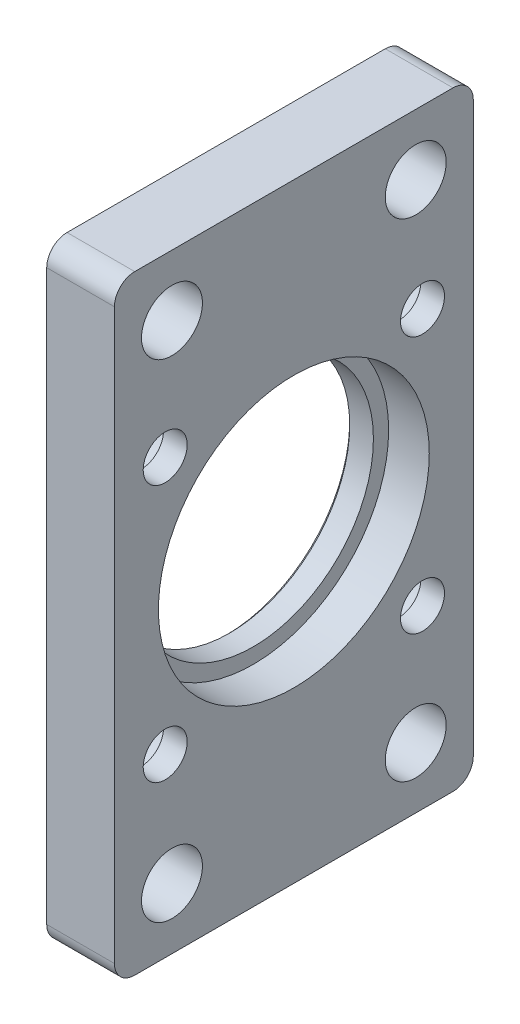
ISO-10303-21;
HEADER;
FILE_DESCRIPTION(('STEP AP214'),'2;1');
FILE_NAME('part.step','',(''),(''),'','','');
FILE_SCHEMA(('AUTOMOTIVE_DESIGN { 1 0 10303 214 1 1 1 1 }'));
ENDSEC;
DATA;
#1=APPLICATION_CONTEXT('core data for automotive mechanical design processes');
#2=APPLICATION_PROTOCOL_DEFINITION('international standard','automotive_design',2000,#1);
#3=PRODUCT_CONTEXT('',#1,'mechanical');
#4=PRODUCT('Part','Part','',(#3));
#5=PRODUCT_RELATED_PRODUCT_CATEGORY('part','',(#4));
#6=PRODUCT_DEFINITION_FORMATION('','',#4);
#7=PRODUCT_DEFINITION_CONTEXT('part definition',#1,'design');
#8=PRODUCT_DEFINITION('design','',#6,#7);
#9=PRODUCT_DEFINITION_SHAPE('','',#8);
#10=(LENGTH_UNIT() NAMED_UNIT(*) SI_UNIT(.MILLI.,.METRE.));
#11=(NAMED_UNIT(*) PLANE_ANGLE_UNIT() SI_UNIT($,.RADIAN.));
#12=(NAMED_UNIT(*) SI_UNIT($,.STERADIAN.) SOLID_ANGLE_UNIT());
#13=UNCERTAINTY_MEASURE_WITH_UNIT(LENGTH_MEASURE(1.E-05),#10,'distance_accuracy_value','');
#14=(GEOMETRIC_REPRESENTATION_CONTEXT(3) GLOBAL_UNCERTAINTY_ASSIGNED_CONTEXT((#13)) GLOBAL_UNIT_ASSIGNED_CONTEXT((#10,
#11,#12)) REPRESENTATION_CONTEXT('',''));
#15=CARTESIAN_POINT('',(0.,0.,0.));
#16=DIRECTION('',(0.,0.,1.));
#17=DIRECTION('',(1.,0.,0.));
#18=AXIS2_PLACEMENT_3D('',#15,#16,#17);
#19=CARTESIAN_POINT('',(-10.,0.,0.));
#20=DIRECTION('',(1.,0.,0.));
#21=DIRECTION('',(0.,0.,-1.));
#22=AXIS2_PLACEMENT_3D('',#19,#20,#21);
#23=CYLINDRICAL_SURFACE('',#22,17.75);
#24=CARTESIAN_POINT('',(-9.5,0.,0.));
#25=DIRECTION('',(1.,0.,0.));
#26=DIRECTION('',(0.,0.,-1.));
#27=AXIS2_PLACEMENT_3D('',#24,#25,#26);
#28=CIRCLE('',#27,17.75);
#29=CARTESIAN_POINT('',(-9.5,0.,-17.75));
#30=VERTEX_POINT('',#29);
#31=EDGE_CURVE('E211',#30,#30,#28,.T.);
#32=ORIENTED_EDGE('',*,*,#31,.F.);
#33=EDGE_LOOP('',(#32));
#34=FACE_BOUND('',#33,.T.);
#35=CARTESIAN_POINT('',(-6.,0.,0.));
#36=DIRECTION('',(1.,0.,0.));
#37=DIRECTION('',(0.,0.,-1.));
#38=AXIS2_PLACEMENT_3D('',#35,#36,#37);
#39=CIRCLE('',#38,17.75);
#40=CARTESIAN_POINT('',(-6.,0.,-17.75));
#41=VERTEX_POINT('',#40);
#42=EDGE_CURVE('E38',#41,#41,#39,.F.);
#43=ORIENTED_EDGE('',*,*,#42,.F.);
#44=EDGE_LOOP('',(#43));
#45=FACE_BOUND('',#44,.T.);
#46=ADVANCED_FACE('F34',(#34,#45),#23,.F.);
#47=CARTESIAN_POINT('',(0.,19.,-19.));
#48=DIRECTION('',(-1.,0.,0.));
#49=DIRECTION('',(0.,0.,1.));
#50=AXIS2_PLACEMENT_3D('',#47,#48,#49);
#51=CYLINDRICAL_SURFACE('',#50,5.5);
#52=CARTESIAN_POINT('',(-9.49999999994589,19.,-19.));
#53=DIRECTION('',(-1.,0.,0.));
#54=DIRECTION('',(0.,0.,1.));
#55=AXIS2_PLACEMENT_3D('',#52,#53,#54);
#56=CIRCLE('',#55,5.50000000003501);
#57=CARTESIAN_POINT('',(-9.49999999994589,19.,-13.499999999965));
#58=VERTEX_POINT('',#57);
#59=EDGE_CURVE('E166',#58,#58,#56,.T.);
#60=ORIENTED_EDGE('',*,*,#59,.T.);
#61=EDGE_LOOP('',(#60));
#62=FACE_BOUND('',#61,.T.);
#63=CARTESIAN_POINT('',(-3.5,19.,-19.));
#64=DIRECTION('',(-1.,0.,0.));
#65=DIRECTION('',(0.,0.,1.));
#66=AXIS2_PLACEMENT_3D('',#63,#64,#65);
#67=CIRCLE('',#66,5.5);
#68=CARTESIAN_POINT('',(-3.5,19.,-13.5));
#69=VERTEX_POINT('',#68);
#70=EDGE_CURVE('E155',#69,#69,#67,.T.);
#71=ORIENTED_EDGE('',*,*,#70,.F.);
#72=EDGE_LOOP('',(#71));
#73=FACE_BOUND('',#72,.T.);
#74=ADVANCED_FACE('F36',(#62,#73),#51,.F.);
#75=CARTESIAN_POINT('',(0.,-19.,-19.));
#76=DIRECTION('',(-1.,0.,0.));
#77=DIRECTION('',(0.,0.,1.));
#78=AXIS2_PLACEMENT_3D('',#75,#76,#77);
#79=CYLINDRICAL_SURFACE('',#78,5.5);
#80=CARTESIAN_POINT('',(-9.49999999994589,-19.,-19.));
#81=DIRECTION('',(-1.,0.,0.));
#82=DIRECTION('',(0.,0.,1.));
#83=AXIS2_PLACEMENT_3D('',#80,#81,#82);
#84=CIRCLE('',#83,5.50000000003501);
#85=CARTESIAN_POINT('',(-9.49999999994589,-19.,-13.499999999965));
#86=VERTEX_POINT('',#85);
#87=EDGE_CURVE('E161',#86,#86,#84,.T.);
#88=ORIENTED_EDGE('',*,*,#87,.T.);
#89=EDGE_LOOP('',(#88));
#90=FACE_BOUND('',#89,.T.);
#91=CARTESIAN_POINT('',(-3.5,-19.,-19.));
#92=DIRECTION('',(-1.,0.,0.));
#93=DIRECTION('',(0.,0.,1.));
#94=AXIS2_PLACEMENT_3D('',#91,#92,#93);
#95=CIRCLE('',#94,5.5);
#96=CARTESIAN_POINT('',(-3.5,-19.,-13.5));
#97=VERTEX_POINT('',#96);
#98=EDGE_CURVE('E258',#97,#97,#95,.T.);
#99=ORIENTED_EDGE('',*,*,#98,.F.);
#100=EDGE_LOOP('',(#99));
#101=FACE_BOUND('',#100,.T.);
#102=ADVANCED_FACE('F267',(#90,#101),#79,.F.);
#103=CARTESIAN_POINT('',(-10.0000000000477,19.,-19.));
#104=DIRECTION('',(-1.,0.,0.));
#105=DIRECTION('',(0.,0.,1.));
#106=AXIS2_PLACEMENT_3D('',#103,#104,#105);
#107=CONICAL_SURFACE('',#106,6.00000000008003,0.785398163340605);
#108=CARTESIAN_POINT('',(-9.99999999999091,19.,-19.));
#109=DIRECTION('',(-1.,0.,0.));
#110=DIRECTION('',(0.,0.,1.));
#111=AXIS2_PLACEMENT_3D('',#108,#109,#110);
#112=CIRCLE('',#111,6.00000000002319);
#113=CARTESIAN_POINT('',(-9.99999999999091,19.,-12.9999999999768));
#114=VERTEX_POINT('',#113);
#115=EDGE_CURVE('E249',#114,#114,#112,.T.);
#116=ORIENTED_EDGE('',*,*,#115,.T.);
#117=EDGE_LOOP('',(#116));
#118=FACE_BOUND('',#117,.T.);
#119=ORIENTED_EDGE('',*,*,#59,.F.);
#120=EDGE_LOOP('',(#119));
#121=FACE_BOUND('',#120,.T.);
#122=ADVANCED_FACE('F274',(#118,#121),#107,.F.);
#123=CARTESIAN_POINT('',(-10.0000000000477,-19.,-19.));
#124=DIRECTION('',(-1.,0.,0.));
#125=DIRECTION('',(0.,0.,1.));
#126=AXIS2_PLACEMENT_3D('',#123,#124,#125);
#127=CONICAL_SURFACE('',#126,6.00000000008003,0.785398163340605);
#128=CARTESIAN_POINT('',(-9.99999999999091,-19.,-19.));
#129=DIRECTION('',(-1.,0.,0.));
#130=DIRECTION('',(0.,0.,1.));
#131=AXIS2_PLACEMENT_3D('',#128,#129,#130);
#132=CIRCLE('',#131,6.00000000002319);
#133=CARTESIAN_POINT('',(-9.99999999999091,-19.,-12.9999999999768));
#134=VERTEX_POINT('',#133);
#135=EDGE_CURVE('E246',#134,#134,#132,.T.);
#136=ORIENTED_EDGE('',*,*,#135,.T.);
#137=EDGE_LOOP('',(#136));
#138=FACE_BOUND('',#137,.T.);
#139=ORIENTED_EDGE('',*,*,#87,.F.);
#140=EDGE_LOOP('',(#139));
#141=FACE_BOUND('',#140,.T.);
#142=ADVANCED_FACE('F404',(#138,#141),#127,.F.);
#143=CARTESIAN_POINT('',(-9.99999999987722,-19.,19.));
#144=DIRECTION('',(-1.,0.,0.));
#145=DIRECTION('',(0.,0.,1.));
#146=AXIS2_PLACEMENT_3D('',#143,#144,#145);
#147=CONICAL_SURFACE('',#146,5.99999999986358,0.785398163454292);
#148=CARTESIAN_POINT('',(-9.99999999999091,-19.,19.));
#149=DIRECTION('',(-1.,0.,0.));
#150=DIRECTION('',(0.,0.,1.));
#151=AXIS2_PLACEMENT_3D('',#148,#149,#150);
#152=CIRCLE('',#151,5.99999999997726);
#153=CARTESIAN_POINT('',(-9.99999999999091,-19.,24.9999999999773));
#154=VERTEX_POINT('',#153);
#155=EDGE_CURVE('E243',#154,#154,#152,.T.);
#156=ORIENTED_EDGE('',*,*,#155,.T.);
#157=EDGE_LOOP('',(#156));
#158=FACE_BOUND('',#157,.T.);
#159=CARTESIAN_POINT('',(-9.5,-19.,19.));
#160=DIRECTION('',(-1.,0.,0.));
#161=DIRECTION('',(0.,0.,1.));
#162=AXIS2_PLACEMENT_3D('',#159,#160,#161);
#163=CIRCLE('',#162,5.5);
#164=CARTESIAN_POINT('',(-9.5,-19.,24.5));
#165=VERTEX_POINT('',#164);
#166=EDGE_CURVE('E156',#165,#165,#163,.F.);
#167=ORIENTED_EDGE('',*,*,#166,.T.);
#168=EDGE_LOOP('',(#167));
#169=FACE_BOUND('',#168,.T.);
#170=ADVANCED_FACE('F400',(#158,#169),#147,.F.);
#171=CARTESIAN_POINT('',(-9.99999999987722,19.,19.));
#172=DIRECTION('',(-1.,0.,0.));
#173=DIRECTION('',(0.,0.,1.));
#174=AXIS2_PLACEMENT_3D('',#171,#172,#173);
#175=CONICAL_SURFACE('',#174,5.99999999986358,0.785398163454292);
#176=CARTESIAN_POINT('',(-9.99999999999091,19.,19.));
#177=DIRECTION('',(-1.,0.,0.));
#178=DIRECTION('',(0.,0.,1.));
#179=AXIS2_PLACEMENT_3D('',#176,#177,#178);
#180=CIRCLE('',#179,5.99999999997726);
#181=CARTESIAN_POINT('',(-9.99999999999091,19.,24.9999999999773));
#182=VERTEX_POINT('',#181);
#183=EDGE_CURVE('E240',#182,#182,#180,.T.);
#184=ORIENTED_EDGE('',*,*,#183,.T.);
#185=EDGE_LOOP('',(#184));
#186=FACE_BOUND('',#185,.T.);
#187=CARTESIAN_POINT('',(-9.5,19.,19.));
#188=DIRECTION('',(-1.,0.,0.));
#189=DIRECTION('',(0.,0.,1.));
#190=AXIS2_PLACEMENT_3D('',#187,#188,#189);
#191=CIRCLE('',#190,5.5);
#192=CARTESIAN_POINT('',(-9.5,19.,24.5));
#193=VERTEX_POINT('',#192);
#194=EDGE_CURVE('E152',#193,#193,#191,.F.);
#195=ORIENTED_EDGE('',*,*,#194,.T.);
#196=EDGE_LOOP('',(#195));
#197=FACE_BOUND('',#196,.T.);
#198=ADVANCED_FACE('F396',(#186,#197),#175,.F.);
#199=CARTESIAN_POINT('',(0.,-19.,19.));
#200=DIRECTION('',(-1.,0.,0.));
#201=DIRECTION('',(0.,0.,1.));
#202=AXIS2_PLACEMENT_3D('',#199,#200,#201);
#203=CYLINDRICAL_SURFACE('',#202,5.5);
#204=ORIENTED_EDGE('',*,*,#166,.F.);
#205=EDGE_LOOP('',(#204));
#206=FACE_BOUND('',#205,.T.);
#207=CARTESIAN_POINT('',(-3.5,-19.,19.));
#208=DIRECTION('',(-1.,0.,0.));
#209=DIRECTION('',(0.,0.,1.));
#210=AXIS2_PLACEMENT_3D('',#207,#208,#209);
#211=CIRCLE('',#210,5.5);
#212=CARTESIAN_POINT('',(-3.5,-19.,24.5));
#213=VERTEX_POINT('',#212);
#214=EDGE_CURVE('E237',#213,#213,#211,.T.);
#215=ORIENTED_EDGE('',*,*,#214,.F.);
#216=EDGE_LOOP('',(#215));
#217=FACE_BOUND('',#216,.T.);
#218=ADVANCED_FACE('F392',(#206,#217),#203,.F.);
#219=CARTESIAN_POINT('',(0.,19.,19.));
#220=DIRECTION('',(-1.,0.,0.));
#221=DIRECTION('',(0.,0.,1.));
#222=AXIS2_PLACEMENT_3D('',#219,#220,#221);
#223=CYLINDRICAL_SURFACE('',#222,5.5);
#224=ORIENTED_EDGE('',*,*,#194,.F.);
#225=EDGE_LOOP('',(#224));
#226=FACE_BOUND('',#225,.T.);
#227=CARTESIAN_POINT('',(-3.5,19.,19.));
#228=DIRECTION('',(-1.,0.,0.));
#229=DIRECTION('',(0.,0.,1.));
#230=AXIS2_PLACEMENT_3D('',#227,#228,#229);
#231=CIRCLE('',#230,5.5);
#232=CARTESIAN_POINT('',(-3.5,19.,24.5));
#233=VERTEX_POINT('',#232);
#234=EDGE_CURVE('E234',#233,#233,#231,.T.);
#235=ORIENTED_EDGE('',*,*,#234,.F.);
#236=EDGE_LOOP('',(#235));
#237=FACE_BOUND('',#236,.T.);
#238=ADVANCED_FACE('F388',(#226,#237),#223,.F.);
#239=CARTESIAN_POINT('',(-9.99999999993406,36.,18.));
#240=DIRECTION('',(-1.,0.,0.));
#241=DIRECTION('',(0.,0.,1.));
#242=AXIS2_PLACEMENT_3D('',#239,#240,#241);
#243=CONICAL_SURFACE('',#242,4.99999999996771,0.785398163397448);
#244=CARTESIAN_POINT('',(-9.99999999999091,36.,18.));
#245=DIRECTION('',(-1.,0.,0.));
#246=DIRECTION('',(0.,0.,1.));
#247=AXIS2_PLACEMENT_3D('',#244,#245,#246);
#248=CIRCLE('',#247,5.00000000002455);
#249=CARTESIAN_POINT('',(-9.99999999999091,36.,23.0000000000246));
#250=VERTEX_POINT('',#249);
#251=EDGE_CURVE('E255',#250,#250,#248,.T.);
#252=ORIENTED_EDGE('',*,*,#251,.T.);
#253=EDGE_LOOP('',(#252));
#254=FACE_BOUND('',#253,.T.);
#255=CARTESIAN_POINT('',(-9.5,36.,18.));
#256=DIRECTION('',(-1.,0.,0.));
#257=DIRECTION('',(0.,0.,1.));
#258=AXIS2_PLACEMENT_3D('',#255,#256,#257);
#259=CIRCLE('',#258,4.5);
#260=CARTESIAN_POINT('',(-9.5,36.,22.5));
#261=VERTEX_POINT('',#260);
#262=EDGE_CURVE('E135',#261,#261,#259,.F.);
#263=ORIENTED_EDGE('',*,*,#262,.T.);
#264=EDGE_LOOP('',(#263));
#265=FACE_BOUND('',#264,.T.);
#266=ADVANCED_FACE('F384',(#254,#265),#243,.F.);
#267=CARTESIAN_POINT('',(-9.99999999993406,-36.,18.));
#268=DIRECTION('',(-1.,0.,0.));
#269=DIRECTION('',(0.,0.,1.));
#270=AXIS2_PLACEMENT_3D('',#267,#268,#269);
#271=CONICAL_SURFACE('',#270,4.99999999996771,0.785398163397448);
#272=CARTESIAN_POINT('',(-9.99999999999091,-36.,18.));
#273=DIRECTION('',(-1.,0.,0.));
#274=DIRECTION('',(0.,0.,1.));
#275=AXIS2_PLACEMENT_3D('',#272,#273,#274);
#276=CIRCLE('',#275,5.00000000002455);
#277=CARTESIAN_POINT('',(-9.99999999999091,-36.,23.0000000000246));
#278=VERTEX_POINT('',#277);
#279=EDGE_CURVE('E252',#278,#278,#276,.T.);
#280=ORIENTED_EDGE('',*,*,#279,.T.);
#281=EDGE_LOOP('',(#280));
#282=FACE_BOUND('',#281,.T.);
#283=CARTESIAN_POINT('',(-9.5,-36.,18.));
#284=DIRECTION('',(-1.,0.,0.));
#285=DIRECTION('',(0.,0.,1.));
#286=AXIS2_PLACEMENT_3D('',#283,#284,#285);
#287=CIRCLE('',#286,4.5);
#288=CARTESIAN_POINT('',(-9.5,-36.,22.5));
#289=VERTEX_POINT('',#288);
#290=EDGE_CURVE('E131',#289,#289,#287,.F.);
#291=ORIENTED_EDGE('',*,*,#290,.T.);
#292=EDGE_LOOP('',(#291));
#293=FACE_BOUND('',#292,.T.);
#294=ADVANCED_FACE('F381',(#282,#293),#271,.F.);
#295=CARTESIAN_POINT('',(-3.5,19.,-24.5));
#296=DIRECTION('',(-1.,0.,0.));
#297=DIRECTION('',(0.,0.,1.));
#298=AXIS2_PLACEMENT_3D('',#295,#296,#297);
#299=PLANE('',#298);
#300=ORIENTED_EDGE('',*,*,#70,.T.);
#301=EDGE_LOOP('',(#300));
#302=FACE_BOUND('',#301,.T.);
#303=CARTESIAN_POINT('',(-3.5,19.,-19.));
#304=DIRECTION('',(-1.,0.,0.));
#305=DIRECTION('',(0.,0.,1.));
#306=AXIS2_PLACEMENT_3D('',#303,#304,#305);
#307=CIRCLE('',#306,3.25);
#308=CARTESIAN_POINT('',(-3.5,19.,-15.75));
#309=VERTEX_POINT('',#308);
#310=EDGE_CURVE('E134',#309,#309,#307,.F.);
#311=ORIENTED_EDGE('',*,*,#310,.T.);
#312=EDGE_LOOP('',(#311));
#313=FACE_BOUND('',#312,.T.);
#314=ADVANCED_FACE('F263',(#302,#313),#299,.T.);
#315=CARTESIAN_POINT('',(-3.5,-19.,-24.5));
#316=DIRECTION('',(-1.,0.,0.));
#317=DIRECTION('',(0.,0.,1.));
#318=AXIS2_PLACEMENT_3D('',#315,#316,#317);
#319=PLANE('',#318);
#320=ORIENTED_EDGE('',*,*,#98,.T.);
#321=EDGE_LOOP('',(#320));
#322=FACE_BOUND('',#321,.T.);
#323=CARTESIAN_POINT('',(-3.5,-19.,-19.));
#324=DIRECTION('',(-1.,0.,0.));
#325=DIRECTION('',(0.,0.,1.));
#326=AXIS2_PLACEMENT_3D('',#323,#324,#325);
#327=CIRCLE('',#326,3.25);
#328=CARTESIAN_POINT('',(-3.5,-19.,-15.75));
#329=VERTEX_POINT('',#328);
#330=EDGE_CURVE('E144',#329,#329,#327,.F.);
#331=ORIENTED_EDGE('',*,*,#330,.T.);
#332=EDGE_LOOP('',(#331));
#333=FACE_BOUND('',#332,.T.);
#334=ADVANCED_FACE('F374',(#322,#333),#319,.T.);
#335=CARTESIAN_POINT('',(-10.,-42.,23.5));
#336=DIRECTION('',(1.,0.,0.));
#337=DIRECTION('',(0.,0.,-1.));
#338=AXIS2_PLACEMENT_3D('',#335,#336,#337);
#339=PLANE('',#338);
#340=CARTESIAN_POINT('',(-9.99999999999091,36.,-18.));
#341=DIRECTION('',(-1.,0.,0.));
#342=DIRECTION('',(0.,0.,1.));
#343=AXIS2_PLACEMENT_3D('',#340,#341,#342);
#344=CIRCLE('',#343,5.00000000008004);
#345=CARTESIAN_POINT('',(-9.99999999999091,36.,-12.99999999992));
#346=VERTEX_POINT('',#345);
#347=EDGE_CURVE('E140',#346,#346,#344,.F.);
#348=ORIENTED_EDGE('',*,*,#347,.T.);
#349=EDGE_LOOP('',(#348));
#350=FACE_BOUND('',#349,.T.);
#351=CARTESIAN_POINT('',(-9.99999999999091,-36.,-18.));
#352=DIRECTION('',(-1.,0.,0.));
#353=DIRECTION('',(0.,0.,1.));
#354=AXIS2_PLACEMENT_3D('',#351,#352,#353);
#355=CIRCLE('',#354,5.00000000008004);
#356=CARTESIAN_POINT('',(-9.99999999999091,-36.,-12.99999999992));
#357=VERTEX_POINT('',#356);
#358=EDGE_CURVE('E228',#357,#357,#355,.F.);
#359=ORIENTED_EDGE('',*,*,#358,.T.);
#360=EDGE_LOOP('',(#359));
#361=FACE_BOUND('',#360,.T.);
#362=CARTESIAN_POINT('',(-10.,0.,0.));
#363=DIRECTION('',(-1.,0.,0.));
#364=DIRECTION('',(0.,-1.,0.));
#365=AXIS2_PLACEMENT_3D('',#362,#363,#364);
#366=CIRCLE('',#365,18.25);
#367=CARTESIAN_POINT('',(-10.,-18.25,0.));
#368=VERTEX_POINT('',#367);
#369=EDGE_CURVE('E231',#368,#368,#366,.F.);
#370=ORIENTED_EDGE('',*,*,#369,.T.);
#371=EDGE_LOOP('',(#370));
#372=FACE_BOUND('',#371,.T.);
#373=ORIENTED_EDGE('',*,*,#183,.F.);
#374=EDGE_LOOP('',(#373));
#375=FACE_BOUND('',#374,.T.);
#376=ORIENTED_EDGE('',*,*,#155,.F.);
#377=EDGE_LOOP('',(#376));
#378=FACE_BOUND('',#377,.T.);
#379=CARTESIAN_POINT('',(-10.,42.,23.5));
#380=DIRECTION('',(-1.,0.,0.));
#381=DIRECTION('',(0.,0.,1.));
#382=AXIS2_PLACEMENT_3D('',#379,#380,#381);
#383=CIRCLE('',#382,2.99999999999998);
#384=CARTESIAN_POINT('',(-10.,45.,23.5));
#385=VERTEX_POINT('',#384);
#386=CARTESIAN_POINT('',(-10.,42.,26.5));
#387=VERTEX_POINT('',#386);
#388=EDGE_CURVE('E216',#385,#387,#383,.F.);
#389=ORIENTED_EDGE('',*,*,#388,.F.);
#390=DIRECTION('',(0.,0.,1.));
#391=VECTOR('',#390,1.);
#392=CARTESIAN_POINT('',(-10.,45.,-23.5));
#393=LINE('',#392,#391);
#394=CARTESIAN_POINT('',(-10.,45.,-23.5));
#395=VERTEX_POINT('',#394);
#396=EDGE_CURVE('E145',#395,#385,#393,.T.);
#397=ORIENTED_EDGE('',*,*,#396,.F.);
#398=CARTESIAN_POINT('',(-10.,42.,-23.5));
#399=DIRECTION('',(-1.,0.,0.));
#400=DIRECTION('',(0.,0.,1.));
#401=AXIS2_PLACEMENT_3D('',#398,#399,#400);
#402=CIRCLE('',#401,2.99999999999999);
#403=CARTESIAN_POINT('',(-10.,42.,-26.5));
#404=VERTEX_POINT('',#403);
#405=EDGE_CURVE('E219',#404,#395,#402,.F.);
#406=ORIENTED_EDGE('',*,*,#405,.F.);
#407=DIRECTION('',(0.,1.,0.));
#408=VECTOR('',#407,1.);
#409=CARTESIAN_POINT('',(-10.,-42.,-26.5));
#410=LINE('',#409,#408);
#411=CARTESIAN_POINT('',(-10.,-42.,-26.5));
#412=VERTEX_POINT('',#411);
#413=EDGE_CURVE('E148',#412,#404,#410,.T.);
#414=ORIENTED_EDGE('',*,*,#413,.F.);
#415=CARTESIAN_POINT('',(-10.,-42.,-23.5));
#416=DIRECTION('',(-1.,0.,0.));
#417=DIRECTION('',(0.,0.,1.));
#418=AXIS2_PLACEMENT_3D('',#415,#416,#417);
#419=CIRCLE('',#418,2.99999999999998);
#420=CARTESIAN_POINT('',(-10.,-45.,-23.5));
#421=VERTEX_POINT('',#420);
#422=EDGE_CURVE('E117',#421,#412,#419,.F.);
#423=ORIENTED_EDGE('',*,*,#422,.F.);
#424=DIRECTION('',(0.,0.,-1.));
#425=VECTOR('',#424,1.);
#426=CARTESIAN_POINT('',(-10.,-45.,23.5));
#427=LINE('',#426,#425);
#428=CARTESIAN_POINT('',(-10.,-45.,23.5));
#429=VERTEX_POINT('',#428);
#430=EDGE_CURVE('E112',#429,#421,#427,.T.);
#431=ORIENTED_EDGE('',*,*,#430,.F.);
#432=CARTESIAN_POINT('',(-10.,-42.,23.5));
#433=DIRECTION('',(-1.,0.,0.));
#434=DIRECTION('',(0.,0.,1.));
#435=AXIS2_PLACEMENT_3D('',#432,#433,#434);
#436=CIRCLE('',#435,2.99999999999999);
#437=CARTESIAN_POINT('',(-10.,-42.,26.5));
#438=VERTEX_POINT('',#437);
#439=EDGE_CURVE('E101',#438,#429,#436,.F.);
#440=ORIENTED_EDGE('',*,*,#439,.F.);
#441=DIRECTION('',(0.,-1.,0.));
#442=VECTOR('',#441,1.);
#443=CARTESIAN_POINT('',(-10.,42.,26.5));
#444=LINE('',#443,#442);
#445=EDGE_CURVE('E96',#387,#438,#444,.T.);
#446=ORIENTED_EDGE('',*,*,#445,.F.);
#447=EDGE_LOOP('',(#389,#397,#406,#414,#423,#431,#440,#446));
#448=FACE_BOUND('',#447,.T.);
#449=ORIENTED_EDGE('',*,*,#135,.F.);
#450=EDGE_LOOP('',(#449));
#451=FACE_BOUND('',#450,.T.);
#452=ORIENTED_EDGE('',*,*,#115,.F.);
#453=EDGE_LOOP('',(#452));
#454=FACE_BOUND('',#453,.T.);
#455=ORIENTED_EDGE('',*,*,#279,.F.);
#456=EDGE_LOOP('',(#455));
#457=FACE_BOUND('',#456,.T.);
#458=ORIENTED_EDGE('',*,*,#251,.F.);
#459=EDGE_LOOP('',(#458));
#460=FACE_BOUND('',#459,.T.);
#461=ADVANCED_FACE('F114',(#350,#361,#372,#375,#378,#448,#451,#454,#457,#460),#339,.F.);
#462=CARTESIAN_POINT('',(-3.5,-19.,13.5));
#463=DIRECTION('',(-1.,0.,0.));
#464=DIRECTION('',(0.,0.,1.));
#465=AXIS2_PLACEMENT_3D('',#462,#463,#464);
#466=PLANE('',#465);
#467=ORIENTED_EDGE('',*,*,#214,.T.);
#468=EDGE_LOOP('',(#467));
#469=FACE_BOUND('',#468,.T.);
#470=CARTESIAN_POINT('',(-3.5,-19.,19.));
#471=DIRECTION('',(-1.,0.,0.));
#472=DIRECTION('',(0.,0.,1.));
#473=AXIS2_PLACEMENT_3D('',#470,#471,#472);
#474=CIRCLE('',#473,3.25);
#475=CARTESIAN_POINT('',(-3.5,-19.,22.25));
#476=VERTEX_POINT('',#475);
#477=EDGE_CURVE('E212',#476,#476,#474,.F.);
#478=ORIENTED_EDGE('',*,*,#477,.T.);
#479=EDGE_LOOP('',(#478));
#480=FACE_BOUND('',#479,.T.);
#481=ADVANCED_FACE('F367',(#469,#480),#466,.T.);
#482=CARTESIAN_POINT('',(-3.5,19.,13.5));
#483=DIRECTION('',(-1.,0.,0.));
#484=DIRECTION('',(0.,0.,1.));
#485=AXIS2_PLACEMENT_3D('',#482,#483,#484);
#486=PLANE('',#485);
#487=ORIENTED_EDGE('',*,*,#234,.T.);
#488=EDGE_LOOP('',(#487));
#489=FACE_BOUND('',#488,.T.);
#490=CARTESIAN_POINT('',(-3.5,19.,19.));
#491=DIRECTION('',(-1.,0.,0.));
#492=DIRECTION('',(0.,0.,1.));
#493=AXIS2_PLACEMENT_3D('',#490,#491,#492);
#494=CIRCLE('',#493,3.25);
#495=CARTESIAN_POINT('',(-3.5,19.,22.25));
#496=VERTEX_POINT('',#495);
#497=EDGE_CURVE('E208',#496,#496,#494,.F.);
#498=ORIENTED_EDGE('',*,*,#497,.T.);
#499=EDGE_LOOP('',(#498));
#500=FACE_BOUND('',#499,.T.);
#501=ADVANCED_FACE('F363',(#489,#500),#486,.T.);
#502=CARTESIAN_POINT('',(-10.,0.,0.));
#503=DIRECTION('',(-1.,0.,0.));
#504=DIRECTION('',(0.,-1.,0.));
#505=AXIS2_PLACEMENT_3D('',#502,#503,#504);
#506=CONICAL_SURFACE('',#505,18.25,0.785398163397445);
#507=ORIENTED_EDGE('',*,*,#31,.T.);
#508=EDGE_LOOP('',(#507));
#509=FACE_BOUND('',#508,.T.);
#510=ORIENTED_EDGE('',*,*,#369,.F.);
#511=EDGE_LOOP('',(#510));
#512=FACE_BOUND('',#511,.T.);
#513=ADVANCED_FACE('F359',(#509,#512),#506,.F.);
#514=CARTESIAN_POINT('',(-9.99999999987722,-36.,-18.));
#515=DIRECTION('',(-1.,0.,0.));
#516=DIRECTION('',(0.,0.,1.));
#517=AXIS2_PLACEMENT_3D('',#514,#515,#516);
#518=CONICAL_SURFACE('',#517,4.99999999996635,0.785398163397448);
#519=ORIENTED_EDGE('',*,*,#358,.F.);
#520=EDGE_LOOP('',(#519));
#521=FACE_BOUND('',#520,.T.);
#522=CARTESIAN_POINT('',(-9.5,-36.,-18.));
#523=DIRECTION('',(-1.,0.,0.));
#524=DIRECTION('',(0.,0.,1.));
#525=AXIS2_PLACEMENT_3D('',#522,#523,#524);
#526=CIRCLE('',#525,4.5);
#527=CARTESIAN_POINT('',(-9.5,-36.,-13.5));
#528=VERTEX_POINT('',#527);
#529=EDGE_CURVE('E692',#528,#528,#526,.F.);
#530=ORIENTED_EDGE('',*,*,#529,.T.);
#531=EDGE_LOOP('',(#530));
#532=FACE_BOUND('',#531,.T.);
#533=ADVANCED_FACE('F355',(#521,#532),#518,.F.);
#534=CARTESIAN_POINT('',(-9.99999999987722,36.,-18.));
#535=DIRECTION('',(-1.,0.,0.));
#536=DIRECTION('',(0.,0.,1.));
#537=AXIS2_PLACEMENT_3D('',#534,#535,#536);
#538=CONICAL_SURFACE('',#537,4.99999999996635,0.785398163397448);
#539=ORIENTED_EDGE('',*,*,#347,.F.);
#540=EDGE_LOOP('',(#539));
#541=FACE_BOUND('',#540,.T.);
#542=CARTESIAN_POINT('',(-9.5,36.,-18.));
#543=DIRECTION('',(-1.,0.,0.));
#544=DIRECTION('',(0.,0.,1.));
#545=AXIS2_PLACEMENT_3D('',#542,#543,#544);
#546=CIRCLE('',#545,4.5);
#547=CARTESIAN_POINT('',(-9.5,36.,-13.5));
#548=VERTEX_POINT('',#547);
#549=EDGE_CURVE('E207',#548,#548,#546,.F.);
#550=ORIENTED_EDGE('',*,*,#549,.T.);
#551=EDGE_LOOP('',(#550));
#552=FACE_BOUND('',#551,.T.);
#553=ADVANCED_FACE('F351',(#541,#552),#538,.F.);
#554=CARTESIAN_POINT('',(0.,36.,18.));
#555=DIRECTION('',(-1.,0.,0.));
#556=DIRECTION('',(0.,0.,1.));
#557=AXIS2_PLACEMENT_3D('',#554,#555,#556);
#558=CYLINDRICAL_SURFACE('',#557,4.5);
#559=ORIENTED_EDGE('',*,*,#262,.F.);
#560=EDGE_LOOP('',(#559));
#561=FACE_BOUND('',#560,.T.);
#562=CARTESIAN_POINT('',(0.,36.,18.));
#563=DIRECTION('',(-1.,0.,0.));
#564=DIRECTION('',(0.,0.,1.));
#565=AXIS2_PLACEMENT_3D('',#562,#563,#564);
#566=CIRCLE('',#565,4.5);
#567=CARTESIAN_POINT('',(0.,36.,22.5));
#568=VERTEX_POINT('',#567);
#569=EDGE_CURVE('E204',#568,#568,#566,.T.);
#570=ORIENTED_EDGE('',*,*,#569,.F.);
#571=EDGE_LOOP('',(#570));
#572=FACE_BOUND('',#571,.T.);
#573=ADVANCED_FACE('F347',(#561,#572),#558,.F.);
#574=CARTESIAN_POINT('',(0.,-36.,18.));
#575=DIRECTION('',(-1.,0.,0.));
#576=DIRECTION('',(0.,0.,1.));
#577=AXIS2_PLACEMENT_3D('',#574,#575,#576);
#578=CYLINDRICAL_SURFACE('',#577,4.5);
#579=ORIENTED_EDGE('',*,*,#290,.F.);
#580=EDGE_LOOP('',(#579));
#581=FACE_BOUND('',#580,.T.);
#582=CARTESIAN_POINT('',(0.,-36.,18.));
#583=DIRECTION('',(-1.,0.,0.));
#584=DIRECTION('',(0.,0.,1.));
#585=AXIS2_PLACEMENT_3D('',#582,#583,#584);
#586=CIRCLE('',#585,4.5);
#587=CARTESIAN_POINT('',(0.,-36.,22.5));
#588=VERTEX_POINT('',#587);
#589=EDGE_CURVE('E201',#588,#588,#586,.T.);
#590=ORIENTED_EDGE('',*,*,#589,.F.);
#591=EDGE_LOOP('',(#590));
#592=FACE_BOUND('',#591,.T.);
#593=ADVANCED_FACE('F343',(#581,#592),#578,.F.);
#594=CARTESIAN_POINT('',(0.,19.,-19.));
#595=DIRECTION('',(-1.,0.,0.));
#596=DIRECTION('',(0.,0.,1.));
#597=AXIS2_PLACEMENT_3D('',#594,#595,#596);
#598=CYLINDRICAL_SURFACE('',#597,3.25);
#599=ORIENTED_EDGE('',*,*,#310,.F.);
#600=EDGE_LOOP('',(#599));
#601=FACE_BOUND('',#600,.T.);
#602=CARTESIAN_POINT('',(0.,19.,-19.));
#603=DIRECTION('',(-1.,0.,0.));
#604=DIRECTION('',(0.,0.,1.));
#605=AXIS2_PLACEMENT_3D('',#602,#603,#604);
#606=CIRCLE('',#605,3.25);
#607=CARTESIAN_POINT('',(0.,19.,-15.75));
#608=VERTEX_POINT('',#607);
#609=EDGE_CURVE('E198',#608,#608,#606,.T.);
#610=ORIENTED_EDGE('',*,*,#609,.F.);
#611=EDGE_LOOP('',(#610));
#612=FACE_BOUND('',#611,.T.);
#613=ADVANCED_FACE('F339',(#601,#612),#598,.F.);
#614=CARTESIAN_POINT('',(0.,-19.,-19.));
#615=DIRECTION('',(-1.,0.,0.));
#616=DIRECTION('',(0.,0.,1.));
#617=AXIS2_PLACEMENT_3D('',#614,#615,#616);
#618=CYLINDRICAL_SURFACE('',#617,3.25);
#619=ORIENTED_EDGE('',*,*,#330,.F.);
#620=EDGE_LOOP('',(#619));
#621=FACE_BOUND('',#620,.T.);
#622=CARTESIAN_POINT('',(0.,-19.,-19.));
#623=DIRECTION('',(-1.,0.,0.));
#624=DIRECTION('',(0.,0.,1.));
#625=AXIS2_PLACEMENT_3D('',#622,#623,#624);
#626=CIRCLE('',#625,3.25);
#627=CARTESIAN_POINT('',(0.,-19.,-15.75));
#628=VERTEX_POINT('',#627);
#629=EDGE_CURVE('E195',#628,#628,#626,.T.);
#630=ORIENTED_EDGE('',*,*,#629,.F.);
#631=EDGE_LOOP('',(#630));
#632=FACE_BOUND('',#631,.T.);
#633=ADVANCED_FACE('F336',(#621,#632),#618,.F.);
#634=CARTESIAN_POINT('',(-10.,42.,26.5));
#635=DIRECTION('',(0.,0.,1.));
#636=DIRECTION('',(0.,-1.,0.));
#637=AXIS2_PLACEMENT_3D('',#634,#635,#636);
#638=PLANE('',#637);
#639=ORIENTED_EDGE('',*,*,#445,.T.);
#640=DIRECTION('',(-1.,0.,0.));
#641=VECTOR('',#640,1.);
#642=CARTESIAN_POINT('',(-10.,-42.,26.5));
#643=LINE('',#642,#641);
#644=CARTESIAN_POINT('',(0.,-42.,26.5));
#645=VERTEX_POINT('',#644);
#646=EDGE_CURVE('E108',#645,#438,#643,.T.);
#647=ORIENTED_EDGE('',*,*,#646,.F.);
#648=DIRECTION('',(0.,1.,0.));
#649=VECTOR('',#648,1.);
#650=CARTESIAN_POINT('',(0.,-42.,26.5));
#651=LINE('',#650,#649);
#652=CARTESIAN_POINT('',(0.,42.,26.5));
#653=VERTEX_POINT('',#652);
#654=EDGE_CURVE('E194',#653,#645,#651,.F.);
#655=ORIENTED_EDGE('',*,*,#654,.F.);
#656=DIRECTION('',(-1.,0.,0.));
#657=VECTOR('',#656,1.);
#658=CARTESIAN_POINT('',(-10.,42.,26.5));
#659=LINE('',#658,#657);
#660=EDGE_CURVE('E215',#387,#653,#659,.F.);
#661=ORIENTED_EDGE('',*,*,#660,.F.);
#662=EDGE_LOOP('',(#639,#647,#655,#661));
#663=FACE_BOUND('',#662,.T.);
#664=ADVANCED_FACE('F333',(#663),#638,.T.);
#665=CARTESIAN_POINT('',(-10.,-42.,23.5));
#666=DIRECTION('',(-1.,0.,0.));
#667=DIRECTION('',(0.,0.,1.));
#668=AXIS2_PLACEMENT_3D('',#665,#666,#667);
#669=CYLINDRICAL_SURFACE('',#668,2.99999999999999);
#670=ORIENTED_EDGE('',*,*,#439,.T.);
#671=DIRECTION('',(1.,0.,0.));
#672=VECTOR('',#671,1.);
#673=CARTESIAN_POINT('',(-10.,-45.,23.5));
#674=LINE('',#673,#672);
#675=CARTESIAN_POINT('',(0.,-45.,23.5));
#676=VERTEX_POINT('',#675);
#677=EDGE_CURVE('E106',#676,#429,#674,.F.);
#678=ORIENTED_EDGE('',*,*,#677,.F.);
#679=CARTESIAN_POINT('',(0.,-42.,23.5));
#680=DIRECTION('',(-1.,0.,0.));
#681=DIRECTION('',(0.,0.,1.));
#682=AXIS2_PLACEMENT_3D('',#679,#680,#681);
#683=CIRCLE('',#682,2.99999999999999);
#684=EDGE_CURVE('E192',#645,#676,#683,.F.);
#685=ORIENTED_EDGE('',*,*,#684,.F.);
#686=ORIENTED_EDGE('',*,*,#646,.T.);
#687=EDGE_LOOP('',(#670,#678,#685,#686));
#688=FACE_BOUND('',#687,.T.);
#689=ADVANCED_FACE('F103',(#688),#669,.T.);
#690=CARTESIAN_POINT('',(-10.,-45.,23.5));
#691=DIRECTION('',(0.,-1.,0.));
#692=DIRECTION('',(0.,0.,-1.));
#693=AXIS2_PLACEMENT_3D('',#690,#691,#692);
#694=PLANE('',#693);
#695=ORIENTED_EDGE('',*,*,#430,.T.);
#696=DIRECTION('',(-1.,0.,0.));
#697=VECTOR('',#696,1.);
#698=CARTESIAN_POINT('',(-10.,-45.,-23.5));
#699=LINE('',#698,#697);
#700=CARTESIAN_POINT('',(0.,-45.,-23.5));
#701=VERTEX_POINT('',#700);
#702=EDGE_CURVE('E120',#701,#421,#699,.T.);
#703=ORIENTED_EDGE('',*,*,#702,.F.);
#704=DIRECTION('',(0.,0.,-1.));
#705=VECTOR('',#704,1.);
#706=CARTESIAN_POINT('',(0.,-45.,23.5));
#707=LINE('',#706,#705);
#708=EDGE_CURVE('E124',#676,#701,#707,.T.);
#709=ORIENTED_EDGE('',*,*,#708,.F.);
#710=ORIENTED_EDGE('',*,*,#677,.T.);
#711=EDGE_LOOP('',(#695,#703,#709,#710));
#712=FACE_BOUND('',#711,.T.);
#713=ADVANCED_FACE('F122',(#712),#694,.T.);
#714=CARTESIAN_POINT('',(-10.,-42.,-23.5));
#715=DIRECTION('',(-1.,0.,0.));
#716=DIRECTION('',(0.,0.,1.));
#717=AXIS2_PLACEMENT_3D('',#714,#715,#716);
#718=CYLINDRICAL_SURFACE('',#717,2.99999999999998);
#719=ORIENTED_EDGE('',*,*,#422,.T.);
#720=DIRECTION('',(1.,0.,0.));
#721=VECTOR('',#720,1.);
#722=CARTESIAN_POINT('',(-10.,-42.,-26.5));
#723=LINE('',#722,#721);
#724=CARTESIAN_POINT('',(0.,-42.,-26.5));
#725=VERTEX_POINT('',#724);
#726=EDGE_CURVE('E150',#725,#412,#723,.F.);
#727=ORIENTED_EDGE('',*,*,#726,.F.);
#728=CARTESIAN_POINT('',(0.,-42.,-23.5));
#729=DIRECTION('',(-1.,0.,0.));
#730=DIRECTION('',(0.,0.,1.));
#731=AXIS2_PLACEMENT_3D('',#728,#729,#730);
#732=CIRCLE('',#731,2.99999999999998);
#733=EDGE_CURVE('E189',#701,#725,#732,.F.);
#734=ORIENTED_EDGE('',*,*,#733,.F.);
#735=ORIENTED_EDGE('',*,*,#702,.T.);
#736=EDGE_LOOP('',(#719,#727,#734,#735));
#737=FACE_BOUND('',#736,.T.);
#738=ADVANCED_FACE('F324',(#737),#718,.T.);
#739=CARTESIAN_POINT('',(-10.,-42.,-26.5));
#740=DIRECTION('',(0.,0.,-1.));
#741=DIRECTION('',(0.,1.,0.));
#742=AXIS2_PLACEMENT_3D('',#739,#740,#741);
#743=PLANE('',#742);
#744=ORIENTED_EDGE('',*,*,#413,.T.);
#745=DIRECTION('',(-1.,0.,0.));
#746=VECTOR('',#745,1.);
#747=CARTESIAN_POINT('',(-10.,42.,-26.5));
#748=LINE('',#747,#746);
#749=CARTESIAN_POINT('',(0.,42.,-26.5));
#750=VERTEX_POINT('',#749);
#751=EDGE_CURVE('E149',#750,#404,#748,.T.);
#752=ORIENTED_EDGE('',*,*,#751,.F.);
#753=DIRECTION('',(0.,1.,0.));
#754=VECTOR('',#753,1.);
#755=CARTESIAN_POINT('',(0.,-42.,-26.5));
#756=LINE('',#755,#754);
#757=EDGE_CURVE('E188',#725,#750,#756,.T.);
#758=ORIENTED_EDGE('',*,*,#757,.F.);
#759=ORIENTED_EDGE('',*,*,#726,.T.);
#760=EDGE_LOOP('',(#744,#752,#758,#759));
#761=FACE_BOUND('',#760,.T.);
#762=ADVANCED_FACE('F320',(#761),#743,.T.);
#763=CARTESIAN_POINT('',(-10.,42.,-23.5));
#764=DIRECTION('',(-1.,0.,0.));
#765=DIRECTION('',(0.,0.,1.));
#766=AXIS2_PLACEMENT_3D('',#763,#764,#765);
#767=CYLINDRICAL_SURFACE('',#766,2.99999999999999);
#768=ORIENTED_EDGE('',*,*,#405,.T.);
#769=DIRECTION('',(1.,0.,0.));
#770=VECTOR('',#769,1.);
#771=CARTESIAN_POINT('',(-10.,45.,-23.5));
#772=LINE('',#771,#770);
#773=CARTESIAN_POINT('',(0.,45.,-23.5));
#774=VERTEX_POINT('',#773);
#775=EDGE_CURVE('E147',#774,#395,#772,.F.);
#776=ORIENTED_EDGE('',*,*,#775,.F.);
#777=CARTESIAN_POINT('',(0.,42.,-23.5));
#778=DIRECTION('',(-1.,0.,0.));
#779=DIRECTION('',(0.,0.,1.));
#780=AXIS2_PLACEMENT_3D('',#777,#778,#779);
#781=CIRCLE('',#780,2.99999999999999);
#782=EDGE_CURVE('E185',#750,#774,#781,.F.);
#783=ORIENTED_EDGE('',*,*,#782,.F.);
#784=ORIENTED_EDGE('',*,*,#751,.T.);
#785=EDGE_LOOP('',(#768,#776,#783,#784));
#786=FACE_BOUND('',#785,.T.);
#787=ADVANCED_FACE('F317',(#786),#767,.T.);
#788=CARTESIAN_POINT('',(-10.,45.,-23.5));
#789=DIRECTION('',(0.,1.,0.));
#790=DIRECTION('',(0.,0.,1.));
#791=AXIS2_PLACEMENT_3D('',#788,#789,#790);
#792=PLANE('',#791);
#793=ORIENTED_EDGE('',*,*,#396,.T.);
#794=DIRECTION('',(-1.,0.,0.));
#795=VECTOR('',#794,1.);
#796=CARTESIAN_POINT('',(-10.,45.,23.5));
#797=LINE('',#796,#795);
#798=CARTESIAN_POINT('',(0.,45.,23.5));
#799=VERTEX_POINT('',#798);
#800=EDGE_CURVE('E53',#799,#385,#797,.T.);
#801=ORIENTED_EDGE('',*,*,#800,.F.);
#802=DIRECTION('',(0.,0.,-1.));
#803=VECTOR('',#802,1.);
#804=CARTESIAN_POINT('',(0.,45.,23.5));
#805=LINE('',#804,#803);
#806=EDGE_CURVE('E184',#774,#799,#805,.F.);
#807=ORIENTED_EDGE('',*,*,#806,.F.);
#808=ORIENTED_EDGE('',*,*,#775,.T.);
#809=EDGE_LOOP('',(#793,#801,#807,#808));
#810=FACE_BOUND('',#809,.T.);
#811=ADVANCED_FACE('F313',(#810),#792,.T.);
#812=CARTESIAN_POINT('',(-10.,42.,23.5));
#813=DIRECTION('',(-1.,0.,0.));
#814=DIRECTION('',(0.,0.,1.));
#815=AXIS2_PLACEMENT_3D('',#812,#813,#814);
#816=CYLINDRICAL_SURFACE('',#815,2.99999999999998);
#817=ORIENTED_EDGE('',*,*,#388,.T.);
#818=ORIENTED_EDGE('',*,*,#660,.T.);
#819=CARTESIAN_POINT('',(0.,42.,23.5));
#820=DIRECTION('',(-1.,0.,0.));
#821=DIRECTION('',(0.,0.,1.));
#822=AXIS2_PLACEMENT_3D('',#819,#820,#821);
#823=CIRCLE('',#822,2.99999999999998);
#824=EDGE_CURVE('E181',#799,#653,#823,.F.);
#825=ORIENTED_EDGE('',*,*,#824,.F.);
#826=ORIENTED_EDGE('',*,*,#800,.T.);
#827=EDGE_LOOP('',(#817,#818,#825,#826));
#828=FACE_BOUND('',#827,.T.);
#829=ADVANCED_FACE('F309',(#828),#816,.T.);
#830=CARTESIAN_POINT('',(0.,-19.,19.));
#831=DIRECTION('',(-1.,0.,0.));
#832=DIRECTION('',(0.,0.,1.));
#833=AXIS2_PLACEMENT_3D('',#830,#831,#832);
#834=CYLINDRICAL_SURFACE('',#833,3.25);
#835=ORIENTED_EDGE('',*,*,#477,.F.);
#836=EDGE_LOOP('',(#835));
#837=FACE_BOUND('',#836,.T.);
#838=CARTESIAN_POINT('',(0.,-19.,19.));
#839=DIRECTION('',(-1.,0.,0.));
#840=DIRECTION('',(0.,0.,1.));
#841=AXIS2_PLACEMENT_3D('',#838,#839,#840);
#842=CIRCLE('',#841,3.25);
#843=CARTESIAN_POINT('',(0.,-19.,22.25));
#844=VERTEX_POINT('',#843);
#845=EDGE_CURVE('E178',#844,#844,#842,.T.);
#846=ORIENTED_EDGE('',*,*,#845,.F.);
#847=EDGE_LOOP('',(#846));
#848=FACE_BOUND('',#847,.T.);
#849=ADVANCED_FACE('F305',(#837,#848),#834,.F.);
#850=CARTESIAN_POINT('',(0.,19.,19.));
#851=DIRECTION('',(-1.,0.,0.));
#852=DIRECTION('',(0.,0.,1.));
#853=AXIS2_PLACEMENT_3D('',#850,#851,#852);
#854=CYLINDRICAL_SURFACE('',#853,3.25);
#855=ORIENTED_EDGE('',*,*,#497,.F.);
#856=EDGE_LOOP('',(#855));
#857=FACE_BOUND('',#856,.T.);
#858=CARTESIAN_POINT('',(0.,19.,19.));
#859=DIRECTION('',(-1.,0.,0.));
#860=DIRECTION('',(0.,0.,1.));
#861=AXIS2_PLACEMENT_3D('',#858,#859,#860);
#862=CIRCLE('',#861,3.25);
#863=CARTESIAN_POINT('',(0.,19.,22.25));
#864=VERTEX_POINT('',#863);
#865=EDGE_CURVE('E175',#864,#864,#862,.T.);
#866=ORIENTED_EDGE('',*,*,#865,.F.);
#867=EDGE_LOOP('',(#866));
#868=FACE_BOUND('',#867,.T.);
#869=ADVANCED_FACE('F300',(#857,#868),#854,.F.);
#870=CARTESIAN_POINT('',(0.,-36.,-18.));
#871=DIRECTION('',(-1.,0.,0.));
#872=DIRECTION('',(0.,0.,1.));
#873=AXIS2_PLACEMENT_3D('',#870,#871,#872);
#874=CYLINDRICAL_SURFACE('',#873,4.5);
#875=ORIENTED_EDGE('',*,*,#529,.F.);
#876=EDGE_LOOP('',(#875));
#877=FACE_BOUND('',#876,.T.);
#878=CARTESIAN_POINT('',(0.,-36.,-18.));
#879=DIRECTION('',(-1.,0.,0.));
#880=DIRECTION('',(0.,0.,1.));
#881=AXIS2_PLACEMENT_3D('',#878,#879,#880);
#882=CIRCLE('',#881,4.5);
#883=CARTESIAN_POINT('',(0.,-36.,-13.5));
#884=VERTEX_POINT('',#883);
#885=EDGE_CURVE('E44',#884,#884,#882,.T.);
#886=ORIENTED_EDGE('',*,*,#885,.F.);
#887=EDGE_LOOP('',(#886));
#888=FACE_BOUND('',#887,.T.);
#889=ADVANCED_FACE('F297',(#877,#888),#874,.F.);
#890=CARTESIAN_POINT('',(0.,36.,-18.));
#891=DIRECTION('',(-1.,0.,0.));
#892=DIRECTION('',(0.,0.,1.));
#893=AXIS2_PLACEMENT_3D('',#890,#891,#892);
#894=CYLINDRICAL_SURFACE('',#893,4.5);
#895=ORIENTED_EDGE('',*,*,#549,.F.);
#896=EDGE_LOOP('',(#895));
#897=FACE_BOUND('',#896,.T.);
#898=CARTESIAN_POINT('',(0.,36.,-18.));
#899=DIRECTION('',(-1.,0.,0.));
#900=DIRECTION('',(0.,0.,1.));
#901=AXIS2_PLACEMENT_3D('',#898,#899,#900);
#902=CIRCLE('',#901,4.5);
#903=CARTESIAN_POINT('',(0.,36.,-13.5));
#904=VERTEX_POINT('',#903);
#905=EDGE_CURVE('E11',#904,#904,#902,.T.);
#906=ORIENTED_EDGE('',*,*,#905,.F.);
#907=EDGE_LOOP('',(#906));
#908=FACE_BOUND('',#907,.T.);
#909=ADVANCED_FACE('F289',(#897,#908),#894,.F.);
#910=CARTESIAN_POINT('',(0.,-42.,23.5));
#911=DIRECTION('',(1.,0.,0.));
#912=DIRECTION('',(0.,0.,-1.));
#913=AXIS2_PLACEMENT_3D('',#910,#911,#912);
#914=PLANE('',#913);
#915=CARTESIAN_POINT('',(0.,0.,0.));
#916=DIRECTION('',(1.,0.,0.));
#917=DIRECTION('',(0.,0.,-1.));
#918=AXIS2_PLACEMENT_3D('',#915,#916,#917);
#919=CIRCLE('',#918,20.);
#920=CARTESIAN_POINT('',(0.,0.,-20.));
#921=VERTEX_POINT('',#920);
#922=EDGE_CURVE('E685',#921,#921,#919,.T.);
#923=ORIENTED_EDGE('',*,*,#922,.F.);
#924=EDGE_LOOP('',(#923));
#925=FACE_BOUND('',#924,.T.);
#926=ORIENTED_EDGE('',*,*,#905,.T.);
#927=EDGE_LOOP('',(#926));
#928=FACE_BOUND('',#927,.T.);
#929=ORIENTED_EDGE('',*,*,#885,.T.);
#930=EDGE_LOOP('',(#929));
#931=FACE_BOUND('',#930,.T.);
#932=ORIENTED_EDGE('',*,*,#865,.T.);
#933=EDGE_LOOP('',(#932));
#934=FACE_BOUND('',#933,.T.);
#935=ORIENTED_EDGE('',*,*,#845,.T.);
#936=EDGE_LOOP('',(#935));
#937=FACE_BOUND('',#936,.T.);
#938=ORIENTED_EDGE('',*,*,#806,.T.);
#939=ORIENTED_EDGE('',*,*,#824,.T.);
#940=ORIENTED_EDGE('',*,*,#654,.T.);
#941=ORIENTED_EDGE('',*,*,#684,.T.);
#942=ORIENTED_EDGE('',*,*,#708,.T.);
#943=ORIENTED_EDGE('',*,*,#733,.T.);
#944=ORIENTED_EDGE('',*,*,#757,.T.);
#945=ORIENTED_EDGE('',*,*,#782,.T.);
#946=EDGE_LOOP('',(#938,#939,#940,#941,#942,#943,#944,#945));
#947=FACE_BOUND('',#946,.T.);
#948=ORIENTED_EDGE('',*,*,#629,.T.);
#949=EDGE_LOOP('',(#948));
#950=FACE_BOUND('',#949,.T.);
#951=ORIENTED_EDGE('',*,*,#609,.T.);
#952=EDGE_LOOP('',(#951));
#953=FACE_BOUND('',#952,.T.);
#954=ORIENTED_EDGE('',*,*,#589,.T.);
#955=EDGE_LOOP('',(#954));
#956=FACE_BOUND('',#955,.T.);
#957=ORIENTED_EDGE('',*,*,#569,.T.);
#958=EDGE_LOOP('',(#957));
#959=FACE_BOUND('',#958,.T.);
#960=ADVANCED_FACE('F278',(#925,#928,#931,#934,#937,#947,#950,#953,#956,#959),#914,.T.);
#961=CARTESIAN_POINT('',(-6.,0.,0.));
#962=DIRECTION('',(1.,0.,0.));
#963=DIRECTION('',(0.,0.,-1.));
#964=AXIS2_PLACEMENT_3D('',#961,#962,#963);
#965=PLANE('',#964);
#966=CARTESIAN_POINT('',(-6.,0.,0.));
#967=DIRECTION('',(1.,0.,0.));
#968=DIRECTION('',(0.,0.,-1.));
#969=AXIS2_PLACEMENT_3D('',#966,#967,#968);
#970=CIRCLE('',#969,20.);
#971=CARTESIAN_POINT('',(-6.,0.,-20.));
#972=VERTEX_POINT('',#971);
#973=EDGE_CURVE('E718',#972,#972,#970,.T.);
#974=ORIENTED_EDGE('',*,*,#973,.T.);
#975=EDGE_LOOP('',(#974));
#976=FACE_BOUND('',#975,.T.);
#977=ORIENTED_EDGE('',*,*,#42,.T.);
#978=EDGE_LOOP('',(#977));
#979=FACE_BOUND('',#978,.T.);
#980=ADVANCED_FACE('F269',(#976,#979),#965,.T.);
#981=CARTESIAN_POINT('',(-6.,0.,0.));
#982=DIRECTION('',(1.,0.,0.));
#983=DIRECTION('',(0.,0.,-1.));
#984=AXIS2_PLACEMENT_3D('',#981,#982,#983);
#985=CYLINDRICAL_SURFACE('',#984,20.);
#986=ORIENTED_EDGE('',*,*,#973,.F.);
#987=EDGE_LOOP('',(#986));
#988=FACE_BOUND('',#987,.T.);
#989=ORIENTED_EDGE('',*,*,#922,.T.);
#990=EDGE_LOOP('',(#989));
#991=FACE_BOUND('',#990,.T.);
#992=ADVANCED_FACE('F280',(#988,#991),#985,.F.);
#993=CLOSED_SHELL('',(#46,#74,#102,#122,#142,#170,#198,#218,#238,#266,#294,#314,#334,#461,#481,
#501,#513,#533,#553,#573,#593,#613,#633,#664,#689,#713,#738,#762,#787,#811,#829,#849,#869,#889,
#909,#960,#980,#992));
#994=MANIFOLD_SOLID_BREP('B2',#993);
#995=ADVANCED_BREP_SHAPE_REPRESENTATION('',(#18,#994),#14);
#996=SHAPE_DEFINITION_REPRESENTATION(#9,#995);
ENDSEC;
END-ISO-10303-21;
